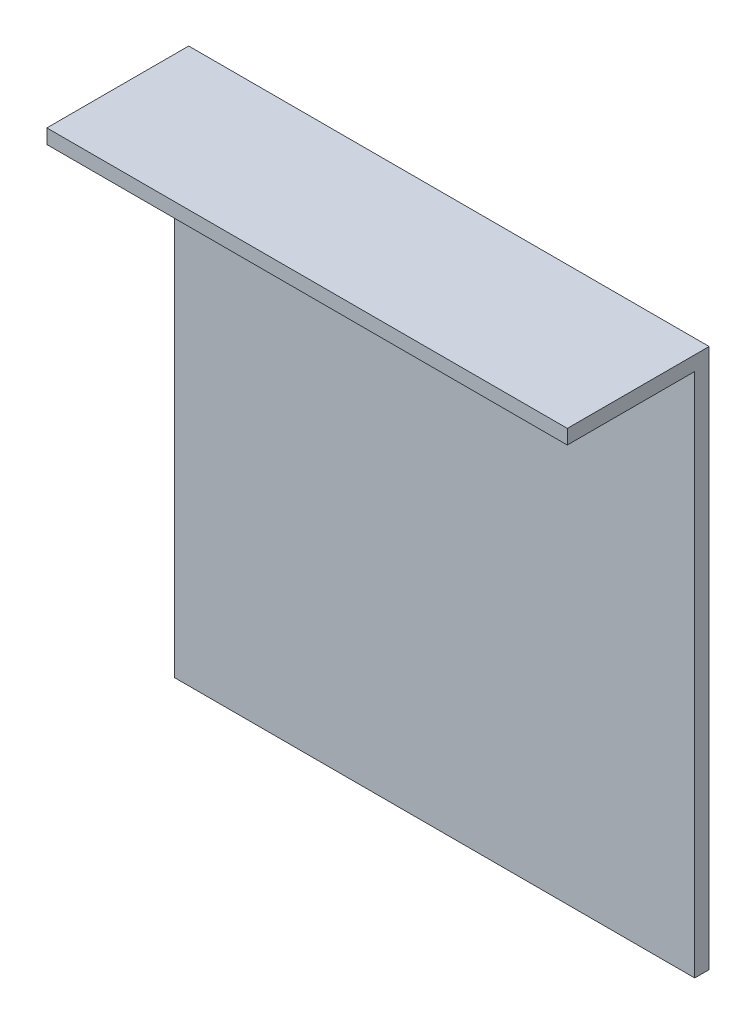
ISO-10303-21;
HEADER;
FILE_DESCRIPTION(('STEP AP214'),'2;1');
FILE_NAME('part.step','',(''),(''),'','','');
FILE_SCHEMA(('AUTOMOTIVE_DESIGN { 1 0 10303 214 1 1 1 1 }'));
ENDSEC;
DATA;
#1=APPLICATION_CONTEXT('core data for automotive mechanical design processes');
#2=APPLICATION_PROTOCOL_DEFINITION('international standard','automotive_design',2000,#1);
#3=PRODUCT_CONTEXT('',#1,'mechanical');
#4=PRODUCT('Part','Part','',(#3));
#5=PRODUCT_RELATED_PRODUCT_CATEGORY('part','',(#4));
#6=PRODUCT_DEFINITION_FORMATION('','',#4);
#7=PRODUCT_DEFINITION_CONTEXT('part definition',#1,'design');
#8=PRODUCT_DEFINITION('design','',#6,#7);
#9=PRODUCT_DEFINITION_SHAPE('','',#8);
#10=(LENGTH_UNIT() NAMED_UNIT(*) SI_UNIT(.MILLI.,.METRE.));
#11=(NAMED_UNIT(*) PLANE_ANGLE_UNIT() SI_UNIT($,.RADIAN.));
#12=(NAMED_UNIT(*) SI_UNIT($,.STERADIAN.) SOLID_ANGLE_UNIT());
#13=UNCERTAINTY_MEASURE_WITH_UNIT(LENGTH_MEASURE(1.E-05),#10,'distance_accuracy_value','');
#14=(GEOMETRIC_REPRESENTATION_CONTEXT(3) GLOBAL_UNCERTAINTY_ASSIGNED_CONTEXT((#13)) GLOBAL_UNIT_ASSIGNED_CONTEXT((#10,
#11,#12)) REPRESENTATION_CONTEXT('',''));
#15=CARTESIAN_POINT('',(0.,0.,0.));
#16=DIRECTION('',(0.,0.,1.));
#17=DIRECTION('',(1.,0.,0.));
#18=AXIS2_PLACEMENT_3D('',#15,#16,#17);
#19=CARTESIAN_POINT('',(-216.5,-230.,12.));
#20=DIRECTION('',(0.,1.,0.));
#21=DIRECTION('',(0.,0.,1.));
#22=AXIS2_PLACEMENT_3D('',#19,#20,#21);
#23=PLANE('',#22);
#24=DIRECTION('',(1.,0.,0.));
#25=VECTOR('',#24,1.);
#26=CARTESIAN_POINT('',(-216.5,-230.,0.));
#27=LINE('',#26,#25);
#28=CARTESIAN_POINT('',(-216.5,-230.,0.));
#29=VERTEX_POINT('',#28);
#30=CARTESIAN_POINT('',(216.5,-230.,0.));
#31=VERTEX_POINT('',#30);
#32=EDGE_CURVE('E91',#29,#31,#27,.T.);
#33=ORIENTED_EDGE('',*,*,#32,.T.);
#34=DIRECTION('',(0.,0.,-1.));
#35=VECTOR('',#34,1.);
#36=CARTESIAN_POINT('',(216.5,-230.,12.));
#37=LINE('',#36,#35);
#38=CARTESIAN_POINT('',(216.5,-230.,12.));
#39=VERTEX_POINT('',#38);
#40=EDGE_CURVE('E11',#39,#31,#37,.T.);
#41=ORIENTED_EDGE('',*,*,#40,.F.);
#42=DIRECTION('',(1.,0.,0.));
#43=VECTOR('',#42,1.);
#44=CARTESIAN_POINT('',(-216.5,-230.,12.));
#45=LINE('',#44,#43);
#46=CARTESIAN_POINT('',(-216.5,-230.,12.));
#47=VERTEX_POINT('',#46);
#48=EDGE_CURVE('E85',#47,#39,#45,.T.);
#49=ORIENTED_EDGE('',*,*,#48,.F.);
#50=DIRECTION('',(0.,0.,-1.));
#51=VECTOR('',#50,1.);
#52=CARTESIAN_POINT('',(-216.5,-230.,12.));
#53=LINE('',#52,#51);
#54=EDGE_CURVE('E77',#47,#29,#53,.T.);
#55=ORIENTED_EDGE('',*,*,#54,.T.);
#56=EDGE_LOOP('',(#33,#41,#49,#55));
#57=FACE_BOUND('',#56,.T.);
#58=ADVANCED_FACE('F33',(#57),#23,.F.);
#59=CARTESIAN_POINT('',(216.5,-230.,12.));
#60=DIRECTION('',(-1.,0.,0.));
#61=DIRECTION('',(0.,0.,1.));
#62=AXIS2_PLACEMENT_3D('',#59,#60,#61);
#63=PLANE('',#62);
#64=DIRECTION('',(0.,1.,0.));
#65=VECTOR('',#64,1.);
#66=CARTESIAN_POINT('',(216.5,-230.,0.));
#67=LINE('',#66,#65);
#68=CARTESIAN_POINT('',(216.5,219.,0.));
#69=VERTEX_POINT('',#68);
#70=EDGE_CURVE('E94',#31,#69,#67,.T.);
#71=ORIENTED_EDGE('',*,*,#70,.T.);
#72=DIRECTION('',(0.,0.,-1.));
#73=VECTOR('',#72,1.);
#74=CARTESIAN_POINT('',(216.5,219.,12.));
#75=LINE('',#74,#73);
#76=CARTESIAN_POINT('',(216.5,219.,118.));
#77=VERTEX_POINT('',#76);
#78=EDGE_CURVE('E41',#77,#69,#75,.T.);
#79=ORIENTED_EDGE('',*,*,#78,.F.);
#80=DIRECTION('',(0.,1.,0.));
#81=VECTOR('',#80,1.);
#82=CARTESIAN_POINT('',(216.5,219.,118.));
#83=LINE('',#82,#81);
#84=CARTESIAN_POINT('',(216.5,207.,118.));
#85=VERTEX_POINT('',#84);
#86=EDGE_CURVE('E119',#85,#77,#83,.T.);
#87=ORIENTED_EDGE('',*,*,#86,.F.);
#88=DIRECTION('',(0.,0.,-1.));
#89=VECTOR('',#88,1.);
#90=CARTESIAN_POINT('',(216.5,207.,118.));
#91=LINE('',#90,#89);
#92=CARTESIAN_POINT('',(216.5,207.,12.));
#93=VERTEX_POINT('',#92);
#94=EDGE_CURVE('E99',#85,#93,#91,.T.);
#95=ORIENTED_EDGE('',*,*,#94,.T.);
#96=DIRECTION('',(0.,1.,0.));
#97=VECTOR('',#96,1.);
#98=CARTESIAN_POINT('',(216.5,-230.,12.));
#99=LINE('',#98,#97);
#100=EDGE_CURVE('E108',#39,#93,#99,.T.);
#101=ORIENTED_EDGE('',*,*,#100,.F.);
#102=ORIENTED_EDGE('',*,*,#40,.T.);
#103=EDGE_LOOP('',(#71,#79,#87,#95,#101,#102));
#104=FACE_BOUND('',#103,.T.);
#105=ADVANCED_FACE('F145',(#104),#63,.F.);
#106=CARTESIAN_POINT('',(-216.5,219.,12.));
#107=DIRECTION('',(0.,-1.,0.));
#108=DIRECTION('',(0.,0.,-1.));
#109=AXIS2_PLACEMENT_3D('',#106,#107,#108);
#110=PLANE('',#109);
#111=DIRECTION('',(-1.,0.,0.));
#112=VECTOR('',#111,1.);
#113=CARTESIAN_POINT('',(-216.5,219.,0.));
#114=LINE('',#113,#112);
#115=CARTESIAN_POINT('',(-216.5,219.,0.));
#116=VERTEX_POINT('',#115);
#117=EDGE_CURVE('E86',#69,#116,#114,.T.);
#118=ORIENTED_EDGE('',*,*,#117,.T.);
#119=DIRECTION('',(0.,0.,-1.));
#120=VECTOR('',#119,1.);
#121=CARTESIAN_POINT('',(-216.5,219.,12.));
#122=LINE('',#121,#120);
#123=CARTESIAN_POINT('',(-216.5,219.,118.));
#124=VERTEX_POINT('',#123);
#125=EDGE_CURVE('E81',#124,#116,#122,.T.);
#126=ORIENTED_EDGE('',*,*,#125,.F.);
#127=DIRECTION('',(-1.,0.,0.));
#128=VECTOR('',#127,1.);
#129=CARTESIAN_POINT('',(216.5,219.,118.));
#130=LINE('',#129,#128);
#131=EDGE_CURVE('E133',#77,#124,#130,.T.);
#132=ORIENTED_EDGE('',*,*,#131,.F.);
#133=ORIENTED_EDGE('',*,*,#78,.T.);
#134=EDGE_LOOP('',(#118,#126,#132,#133));
#135=FACE_BOUND('',#134,.T.);
#136=ADVANCED_FACE('F153',(#135),#110,.F.);
#137=CARTESIAN_POINT('',(-216.5,-230.,12.));
#138=DIRECTION('',(1.,0.,0.));
#139=DIRECTION('',(0.,0.,-1.));
#140=AXIS2_PLACEMENT_3D('',#137,#138,#139);
#141=PLANE('',#140);
#142=DIRECTION('',(0.,-1.,0.));
#143=VECTOR('',#142,1.);
#144=CARTESIAN_POINT('',(-216.5,-230.,0.));
#145=LINE('',#144,#143);
#146=EDGE_CURVE('E74',#116,#29,#145,.T.);
#147=ORIENTED_EDGE('',*,*,#146,.T.);
#148=ORIENTED_EDGE('',*,*,#54,.F.);
#149=DIRECTION('',(0.,-1.,0.));
#150=VECTOR('',#149,1.);
#151=CARTESIAN_POINT('',(-216.5,-230.,12.));
#152=LINE('',#151,#150);
#153=CARTESIAN_POINT('',(-216.5,207.,12.));
#154=VERTEX_POINT('',#153);
#155=EDGE_CURVE('E54',#154,#47,#152,.T.);
#156=ORIENTED_EDGE('',*,*,#155,.F.);
#157=DIRECTION('',(0.,0.,-1.));
#158=VECTOR('',#157,1.);
#159=CARTESIAN_POINT('',(-216.5,207.,118.));
#160=LINE('',#159,#158);
#161=CARTESIAN_POINT('',(-216.5,207.,118.));
#162=VERTEX_POINT('',#161);
#163=EDGE_CURVE('E95',#162,#154,#160,.T.);
#164=ORIENTED_EDGE('',*,*,#163,.F.);
#165=DIRECTION('',(0.,-1.,0.));
#166=VECTOR('',#165,1.);
#167=CARTESIAN_POINT('',(-216.5,219.,118.));
#168=LINE('',#167,#166);
#169=EDGE_CURVE('E128',#124,#162,#168,.T.);
#170=ORIENTED_EDGE('',*,*,#169,.F.);
#171=ORIENTED_EDGE('',*,*,#125,.T.);
#172=EDGE_LOOP('',(#147,#148,#156,#164,#170,#171));
#173=FACE_BOUND('',#172,.T.);
#174=ADVANCED_FACE('F76',(#173),#141,.F.);
#175=CARTESIAN_POINT('',(0.,0.,12.));
#176=DIRECTION('',(0.,0.,1.));
#177=DIRECTION('',(1.,0.,0.));
#178=AXIS2_PLACEMENT_3D('',#175,#176,#177);
#179=PLANE('',#178);
#180=DIRECTION('',(1.,0.,0.));
#181=VECTOR('',#180,1.);
#182=CARTESIAN_POINT('',(216.5,207.,12.));
#183=LINE('',#182,#181);
#184=EDGE_CURVE('E49',#154,#93,#183,.T.);
#185=ORIENTED_EDGE('',*,*,#184,.F.);
#186=ORIENTED_EDGE('',*,*,#155,.T.);
#187=ORIENTED_EDGE('',*,*,#48,.T.);
#188=ORIENTED_EDGE('',*,*,#100,.T.);
#189=EDGE_LOOP('',(#185,#186,#187,#188));
#190=FACE_BOUND('',#189,.T.);
#191=ADVANCED_FACE('F149',(#190),#179,.T.);
#192=CARTESIAN_POINT('',(0.,0.,0.));
#193=DIRECTION('',(0.,0.,1.));
#194=DIRECTION('',(1.,0.,0.));
#195=AXIS2_PLACEMENT_3D('',#192,#193,#194);
#196=PLANE('',#195);
#197=ORIENTED_EDGE('',*,*,#32,.F.);
#198=ORIENTED_EDGE('',*,*,#146,.F.);
#199=ORIENTED_EDGE('',*,*,#117,.F.);
#200=ORIENTED_EDGE('',*,*,#70,.F.);
#201=EDGE_LOOP('',(#197,#198,#199,#200));
#202=FACE_BOUND('',#201,.T.);
#203=ADVANCED_FACE('F93',(#202),#196,.F.);
#204=CARTESIAN_POINT('',(216.5,207.,118.));
#205=DIRECTION('',(0.,1.,0.));
#206=DIRECTION('',(-1.,0.,0.));
#207=AXIS2_PLACEMENT_3D('',#204,#205,#206);
#208=PLANE('',#207);
#209=ORIENTED_EDGE('',*,*,#184,.T.);
#210=ORIENTED_EDGE('',*,*,#94,.F.);
#211=DIRECTION('',(1.,0.,0.));
#212=VECTOR('',#211,1.);
#213=CARTESIAN_POINT('',(216.5,207.,118.));
#214=LINE('',#213,#212);
#215=EDGE_CURVE('E116',#162,#85,#214,.T.);
#216=ORIENTED_EDGE('',*,*,#215,.F.);
#217=ORIENTED_EDGE('',*,*,#163,.T.);
#218=EDGE_LOOP('',(#209,#210,#216,#217));
#219=FACE_BOUND('',#218,.T.);
#220=ADVANCED_FACE('F151',(#219),#208,.F.);
#221=CARTESIAN_POINT('',(0.,0.,118.));
#222=DIRECTION('',(0.,0.,-1.));
#223=DIRECTION('',(-1.,0.,0.));
#224=AXIS2_PLACEMENT_3D('',#221,#222,#223);
#225=PLANE('',#224);
#226=ORIENTED_EDGE('',*,*,#86,.T.);
#227=ORIENTED_EDGE('',*,*,#131,.T.);
#228=ORIENTED_EDGE('',*,*,#169,.T.);
#229=ORIENTED_EDGE('',*,*,#215,.T.);
#230=EDGE_LOOP('',(#226,#227,#228,#229));
#231=FACE_BOUND('',#230,.T.);
#232=ADVANCED_FACE('F140',(#231),#225,.F.);
#233=CLOSED_SHELL('',(#58,#105,#136,#174,#191,#203,#220,#232));
#234=MANIFOLD_SOLID_BREP('B2',#233);
#235=ADVANCED_BREP_SHAPE_REPRESENTATION('',(#18,#234),#14);
#236=SHAPE_DEFINITION_REPRESENTATION(#9,#235);
ENDSEC;
END-ISO-10303-21;
